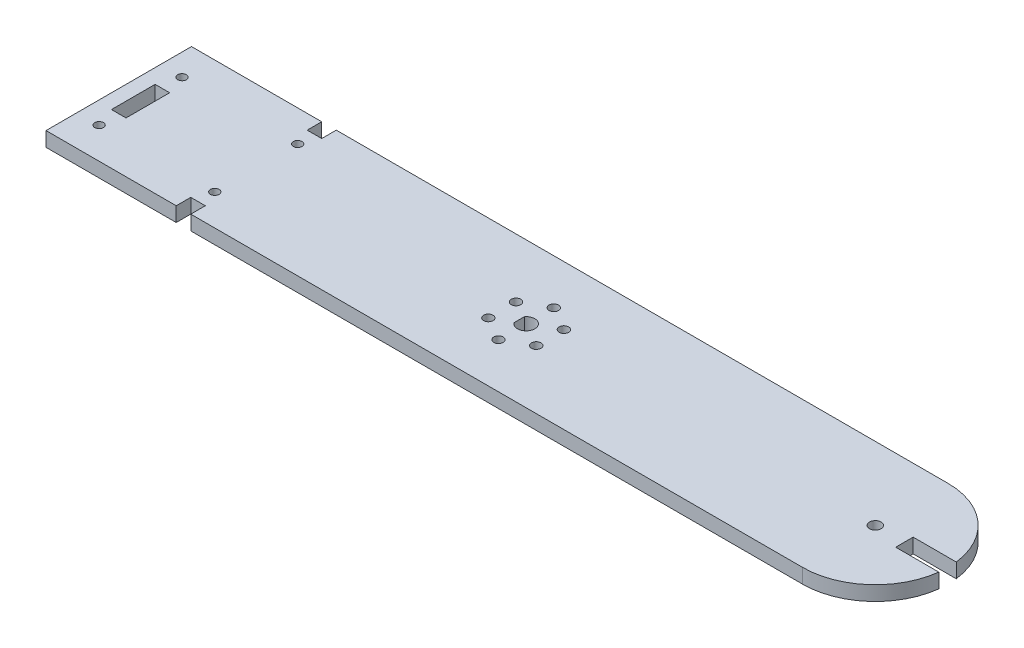
ISO-10303-21;
HEADER;
FILE_DESCRIPTION(('STEP AP214'),'2;1');
FILE_NAME('part.step','',(''),(''),'','','');
FILE_SCHEMA(('AUTOMOTIVE_DESIGN { 1 0 10303 214 1 1 1 1 }'));
ENDSEC;
DATA;
#1=APPLICATION_CONTEXT('core data for automotive mechanical design processes');
#2=APPLICATION_PROTOCOL_DEFINITION('international standard','automotive_design',2000,#1);
#3=PRODUCT_CONTEXT('',#1,'mechanical');
#4=PRODUCT('Part','Part','',(#3));
#5=PRODUCT_RELATED_PRODUCT_CATEGORY('part','',(#4));
#6=PRODUCT_DEFINITION_FORMATION('','',#4);
#7=PRODUCT_DEFINITION_CONTEXT('part definition',#1,'design');
#8=PRODUCT_DEFINITION('design','',#6,#7);
#9=PRODUCT_DEFINITION_SHAPE('','',#8);
#10=(LENGTH_UNIT() NAMED_UNIT(*) SI_UNIT(.MILLI.,.METRE.));
#11=(NAMED_UNIT(*) PLANE_ANGLE_UNIT() SI_UNIT($,.RADIAN.));
#12=(NAMED_UNIT(*) SI_UNIT($,.STERADIAN.) SOLID_ANGLE_UNIT());
#13=UNCERTAINTY_MEASURE_WITH_UNIT(LENGTH_MEASURE(1.E-05),#10,'distance_accuracy_value','');
#14=(GEOMETRIC_REPRESENTATION_CONTEXT(3) GLOBAL_UNCERTAINTY_ASSIGNED_CONTEXT((#13)) GLOBAL_UNIT_ASSIGNED_CONTEXT((#10,
#11,#12)) REPRESENTATION_CONTEXT('',''));
#15=CARTESIAN_POINT('',(0.,0.,0.));
#16=DIRECTION('',(0.,0.,1.));
#17=DIRECTION('',(1.,0.,0.));
#18=AXIS2_PLACEMENT_3D('',#15,#16,#17);
#19=CARTESIAN_POINT('',(260.,5.,-25.));
#20=DIRECTION('',(0.,-1.,0.));
#21=DIRECTION('',(0.,0.,-1.));
#22=AXIS2_PLACEMENT_3D('',#19,#20,#21);
#23=PLANE('',#22);
#24=DIRECTION('',(0.,0.,-1.));
#25=VECTOR('',#24,1.);
#26=CARTESIAN_POINT('',(137.6,5.,-23.1999999999999));
#27=LINE('',#26,#25);
#28=CARTESIAN_POINT('',(137.6,5.,-23.1999999999999));
#29=VERTEX_POINT('',#28);
#30=CARTESIAN_POINT('',(137.6,5.,-26.7999999999999));
#31=VERTEX_POINT('',#30);
#32=EDGE_CURVE('E862',#29,#31,#27,.T.);
#33=ORIENTED_EDGE('',*,*,#32,.T.);
#34=CARTESIAN_POINT('',(140.,5.,-25.));
#35=DIRECTION('',(0.,-1.,0.));
#36=DIRECTION('',(0.,0.,-1.));
#37=AXIS2_PLACEMENT_3D('',#34,#35,#36);
#38=CIRCLE('',#37,3.00000000000001);
#39=EDGE_CURVE('E725',#31,#29,#38,.T.);
#40=ORIENTED_EDGE('',*,*,#39,.T.);
#41=EDGE_LOOP('',(#33,#40));
#42=FACE_BOUND('',#41,.T.);
#43=CARTESIAN_POINT('',(47.25,5.,-10.75));
#44=DIRECTION('',(0.,-1.,0.));
#45=DIRECTION('',(0.,0.,-1.));
#46=AXIS2_PLACEMENT_3D('',#43,#44,#45);
#47=CIRCLE('',#46,1.5);
#48=CARTESIAN_POINT('',(47.25,5.,-12.25));
#49=VERTEX_POINT('',#48);
#50=EDGE_CURVE('E892',#49,#49,#47,.T.);
#51=ORIENTED_EDGE('',*,*,#50,.T.);
#52=EDGE_LOOP('',(#51));
#53=FACE_BOUND('',#52,.T.);
#54=CARTESIAN_POINT('',(7.50000000000001,5.,-39.25));
#55=DIRECTION('',(0.,-1.,0.));
#56=DIRECTION('',(0.,0.,-1.));
#57=AXIS2_PLACEMENT_3D('',#54,#55,#56);
#58=CIRCLE('',#57,1.5);
#59=CARTESIAN_POINT('',(7.50000000000001,5.,-40.75));
#60=VERTEX_POINT('',#59);
#61=EDGE_CURVE('E898',#60,#60,#58,.T.);
#62=ORIENTED_EDGE('',*,*,#61,.T.);
#63=EDGE_LOOP('',(#62));
#64=FACE_BOUND('',#63,.T.);
#65=DIRECTION('',(1.,0.,0.));
#66=VECTOR('',#65,1.);
#67=CARTESIAN_POINT('',(0.,5.,0.));
#68=LINE('',#67,#66);
#69=CARTESIAN_POINT('',(0.,5.,0.));
#70=VERTEX_POINT('',#69);
#71=CARTESIAN_POINT('',(44.75,5.,0.));
#72=VERTEX_POINT('',#71);
#73=EDGE_CURVE('E936',#70,#72,#68,.T.);
#74=ORIENTED_EDGE('',*,*,#73,.T.);
#75=DIRECTION('',(0.,0.,-1.));
#76=VECTOR('',#75,1.);
#77=CARTESIAN_POINT('',(44.75,5.,0.));
#78=LINE('',#77,#76);
#79=CARTESIAN_POINT('',(44.75,5.,-5.));
#80=VERTEX_POINT('',#79);
#81=EDGE_CURVE('E939',#72,#80,#78,.T.);
#82=ORIENTED_EDGE('',*,*,#81,.T.);
#83=DIRECTION('',(1.,0.,0.));
#84=VECTOR('',#83,1.);
#85=CARTESIAN_POINT('',(44.75,5.,-5.));
#86=LINE('',#85,#84);
#87=CARTESIAN_POINT('',(49.75,5.,-5.));
#88=VERTEX_POINT('',#87);
#89=EDGE_CURVE('E942',#80,#88,#86,.T.);
#90=ORIENTED_EDGE('',*,*,#89,.T.);
#91=DIRECTION('',(0.,0.,1.));
#92=VECTOR('',#91,1.);
#93=CARTESIAN_POINT('',(49.75,5.,-5.));
#94=LINE('',#93,#92);
#95=CARTESIAN_POINT('',(49.75,5.,0.));
#96=VERTEX_POINT('',#95);
#97=EDGE_CURVE('E944',#88,#96,#94,.T.);
#98=ORIENTED_EDGE('',*,*,#97,.T.);
#99=DIRECTION('',(1.,0.,0.));
#100=VECTOR('',#99,1.);
#101=CARTESIAN_POINT('',(49.75,5.,0.));
#102=LINE('',#101,#100);
#103=CARTESIAN_POINT('',(260.,5.,0.));
#104=VERTEX_POINT('',#103);
#105=EDGE_CURVE('E946',#96,#104,#102,.T.);
#106=ORIENTED_EDGE('',*,*,#105,.T.);
#107=CARTESIAN_POINT('',(260.,5.,-25.));
#108=DIRECTION('',(0.,-1.,0.));
#109=DIRECTION('',(0.,0.,-1.));
#110=AXIS2_PLACEMENT_3D('',#107,#108,#109);
#111=CIRCLE('',#110,25.);
#112=CARTESIAN_POINT('',(284.819347291982,5.,-22.));
#113=VERTEX_POINT('',#112);
#114=EDGE_CURVE('E948',#113,#104,#111,.T.);
#115=ORIENTED_EDGE('',*,*,#114,.F.);
#116=DIRECTION('',(1.,0.,0.));
#117=VECTOR('',#116,1.);
#118=CARTESIAN_POINT('',(270.,5.,-22.));
#119=LINE('',#118,#117);
#120=CARTESIAN_POINT('',(270.,5.,-22.));
#121=VERTEX_POINT('',#120);
#122=EDGE_CURVE('E951',#121,#113,#119,.T.);
#123=ORIENTED_EDGE('',*,*,#122,.F.);
#124=DIRECTION('',(0.,0.,-1.));
#125=VECTOR('',#124,1.);
#126=CARTESIAN_POINT('',(270.,5.,-22.));
#127=LINE('',#126,#125);
#128=CARTESIAN_POINT('',(270.,5.,-28.));
#129=VERTEX_POINT('',#128);
#130=EDGE_CURVE('E954',#121,#129,#127,.T.);
#131=ORIENTED_EDGE('',*,*,#130,.T.);
#132=DIRECTION('',(1.,0.,0.));
#133=VECTOR('',#132,1.);
#134=CARTESIAN_POINT('',(270.,5.,-28.));
#135=LINE('',#134,#133);
#136=CARTESIAN_POINT('',(284.819347291982,5.,-28.));
#137=VERTEX_POINT('',#136);
#138=EDGE_CURVE('E956',#129,#137,#135,.T.);
#139=ORIENTED_EDGE('',*,*,#138,.T.);
#140=CARTESIAN_POINT('',(260.,5.,-25.));
#141=DIRECTION('',(0.,-1.,0.));
#142=DIRECTION('',(0.,0.,-1.));
#143=AXIS2_PLACEMENT_3D('',#140,#141,#142);
#144=CIRCLE('',#143,25.);
#145=CARTESIAN_POINT('',(260.,5.,-50.));
#146=VERTEX_POINT('',#145);
#147=EDGE_CURVE('E958',#146,#137,#144,.T.);
#148=ORIENTED_EDGE('',*,*,#147,.F.);
#149=DIRECTION('',(1.,0.,0.));
#150=VECTOR('',#149,1.);
#151=CARTESIAN_POINT('',(49.75,5.,-50.));
#152=LINE('',#151,#150);
#153=CARTESIAN_POINT('',(49.75,5.,-50.));
#154=VERTEX_POINT('',#153);
#155=EDGE_CURVE('E961',#154,#146,#152,.T.);
#156=ORIENTED_EDGE('',*,*,#155,.F.);
#157=DIRECTION('',(0.,0.,-1.));
#158=VECTOR('',#157,1.);
#159=CARTESIAN_POINT('',(49.75,5.,-45.));
#160=LINE('',#159,#158);
#161=CARTESIAN_POINT('',(49.75,5.,-45.));
#162=VERTEX_POINT('',#161);
#163=EDGE_CURVE('E964',#162,#154,#160,.T.);
#164=ORIENTED_EDGE('',*,*,#163,.F.);
#165=DIRECTION('',(1.,0.,0.));
#166=VECTOR('',#165,1.);
#167=CARTESIAN_POINT('',(44.75,5.,-45.));
#168=LINE('',#167,#166);
#169=CARTESIAN_POINT('',(44.75,5.,-45.));
#170=VERTEX_POINT('',#169);
#171=EDGE_CURVE('E967',#170,#162,#168,.T.);
#172=ORIENTED_EDGE('',*,*,#171,.F.);
#173=DIRECTION('',(0.,0.,1.));
#174=VECTOR('',#173,1.);
#175=CARTESIAN_POINT('',(44.75,5.,-50.));
#176=LINE('',#175,#174);
#177=CARTESIAN_POINT('',(44.75,5.,-50.));
#178=VERTEX_POINT('',#177);
#179=EDGE_CURVE('E970',#178,#170,#176,.T.);
#180=ORIENTED_EDGE('',*,*,#179,.F.);
#181=DIRECTION('',(1.,0.,0.));
#182=VECTOR('',#181,1.);
#183=CARTESIAN_POINT('',(0.,5.,-50.));
#184=LINE('',#183,#182);
#185=CARTESIAN_POINT('',(0.,5.,-50.));
#186=VERTEX_POINT('',#185);
#187=EDGE_CURVE('E973',#186,#178,#184,.T.);
#188=ORIENTED_EDGE('',*,*,#187,.F.);
#189=DIRECTION('',(0.,0.,-1.));
#190=VECTOR('',#189,1.);
#191=CARTESIAN_POINT('',(0.,5.,0.));
#192=LINE('',#191,#190);
#193=EDGE_CURVE('E976',#70,#186,#192,.T.);
#194=ORIENTED_EDGE('',*,*,#193,.F.);
#195=EDGE_LOOP('',(#74,#82,#90,#98,#106,#115,#123,#131,#139,#148,#156,#164,#172,#180,#188,#194));
#196=FACE_BOUND('',#195,.T.);
#197=DIRECTION('',(0.,0.,1.));
#198=VECTOR('',#197,1.);
#199=CARTESIAN_POINT('',(5.,5.,-32.5));
#200=LINE('',#199,#198);
#201=CARTESIAN_POINT('',(5.,5.,-32.5));
#202=VERTEX_POINT('',#201);
#203=CARTESIAN_POINT('',(5.,5.,-17.5));
#204=VERTEX_POINT('',#203);
#205=EDGE_CURVE('E904',#202,#204,#200,.T.);
#206=ORIENTED_EDGE('',*,*,#205,.F.);
#207=DIRECTION('',(1.,0.,0.));
#208=VECTOR('',#207,1.);
#209=CARTESIAN_POINT('',(5.,5.,-32.5));
#210=LINE('',#209,#208);
#211=CARTESIAN_POINT('',(10.,5.,-32.5));
#212=VERTEX_POINT('',#211);
#213=EDGE_CURVE('E912',#202,#212,#210,.T.);
#214=ORIENTED_EDGE('',*,*,#213,.T.);
#215=DIRECTION('',(0.,0.,1.));
#216=VECTOR('',#215,1.);
#217=CARTESIAN_POINT('',(10.,5.,-32.5));
#218=LINE('',#217,#216);
#219=CARTESIAN_POINT('',(10.,5.,-17.5));
#220=VERTEX_POINT('',#219);
#221=EDGE_CURVE('E909',#212,#220,#218,.T.);
#222=ORIENTED_EDGE('',*,*,#221,.T.);
#223=DIRECTION('',(1.,0.,0.));
#224=VECTOR('',#223,1.);
#225=CARTESIAN_POINT('',(5.,5.,-17.5));
#226=LINE('',#225,#224);
#227=EDGE_CURVE('E906',#204,#220,#226,.T.);
#228=ORIENTED_EDGE('',*,*,#227,.F.);
#229=EDGE_LOOP('',(#206,#214,#222,#228));
#230=FACE_BOUND('',#229,.T.);
#231=CARTESIAN_POINT('',(47.25,5.,-39.25));
#232=DIRECTION('',(0.,1.,0.));
#233=DIRECTION('',(0.,0.,1.));
#234=AXIS2_PLACEMENT_3D('',#231,#232,#233);
#235=CIRCLE('',#234,1.5);
#236=CARTESIAN_POINT('',(47.25,5.,-37.75));
#237=VERTEX_POINT('',#236);
#238=EDGE_CURVE('E886',#237,#237,#235,.T.);
#239=ORIENTED_EDGE('',*,*,#238,.F.);
#240=EDGE_LOOP('',(#239));
#241=FACE_BOUND('',#240,.T.);
#242=CARTESIAN_POINT('',(7.50000000000001,5.,-10.75));
#243=DIRECTION('',(0.,1.,0.));
#244=DIRECTION('',(0.,0.,1.));
#245=AXIS2_PLACEMENT_3D('',#242,#243,#244);
#246=CIRCLE('',#245,1.5);
#247=CARTESIAN_POINT('',(7.50000000000001,5.,-9.25000000000001));
#248=VERTEX_POINT('',#247);
#249=EDGE_CURVE('E880',#248,#248,#246,.T.);
#250=ORIENTED_EDGE('',*,*,#249,.F.);
#251=EDGE_LOOP('',(#250));
#252=FACE_BOUND('',#251,.T.);
#253=CARTESIAN_POINT('',(131.772758664048,5.,-20.2499999999999));
#254=DIRECTION('',(0.,1.,0.));
#255=DIRECTION('',(0.,0.,1.));
#256=AXIS2_PLACEMENT_3D('',#253,#254,#255);
#257=CIRCLE('',#256,1.63);
#258=CARTESIAN_POINT('',(131.772758664048,5.,-18.6199999999999));
#259=VERTEX_POINT('',#258);
#260=EDGE_CURVE('E876',#259,#259,#257,.T.);
#261=ORIENTED_EDGE('',*,*,#260,.F.);
#262=EDGE_LOOP('',(#261));
#263=FACE_BOUND('',#262,.T.);
#264=CARTESIAN_POINT('',(131.772758664048,5.,-29.7499999999998));
#265=DIRECTION('',(0.,1.,0.));
#266=DIRECTION('',(0.,0.,1.));
#267=AXIS2_PLACEMENT_3D('',#264,#265,#266);
#268=CIRCLE('',#267,1.63);
#269=CARTESIAN_POINT('',(131.772758664048,5.,-28.1199999999998));
#270=VERTEX_POINT('',#269);
#271=EDGE_CURVE('E1470',#270,#270,#268,.T.);
#272=ORIENTED_EDGE('',*,*,#271,.F.);
#273=EDGE_LOOP('',(#272));
#274=FACE_BOUND('',#273,.T.);
#275=CARTESIAN_POINT('',(140.,5.,-34.5));
#276=DIRECTION('',(0.,1.,0.));
#277=DIRECTION('',(0.,0.,1.));
#278=AXIS2_PLACEMENT_3D('',#275,#276,#277);
#279=CIRCLE('',#278,1.62999999999999);
#280=CARTESIAN_POINT('',(140.,5.,-32.87));
#281=VERTEX_POINT('',#280);
#282=EDGE_CURVE('E1464',#281,#281,#279,.T.);
#283=ORIENTED_EDGE('',*,*,#282,.F.);
#284=EDGE_LOOP('',(#283));
#285=FACE_BOUND('',#284,.T.);
#286=CARTESIAN_POINT('',(148.227241335952,5.,-29.7500000000002));
#287=DIRECTION('',(0.,1.,0.));
#288=DIRECTION('',(0.,0.,1.));
#289=AXIS2_PLACEMENT_3D('',#286,#287,#288);
#290=CIRCLE('',#289,1.63);
#291=CARTESIAN_POINT('',(148.227241335952,5.,-28.1200000000002));
#292=VERTEX_POINT('',#291);
#293=EDGE_CURVE('E1458',#292,#292,#290,.T.);
#294=ORIENTED_EDGE('',*,*,#293,.F.);
#295=EDGE_LOOP('',(#294));
#296=FACE_BOUND('',#295,.T.);
#297=CARTESIAN_POINT('',(148.227241335952,5.,-20.2500000000002));
#298=DIRECTION('',(0.,1.,0.));
#299=DIRECTION('',(0.,0.,1.));
#300=AXIS2_PLACEMENT_3D('',#297,#298,#299);
#301=CIRCLE('',#300,1.63);
#302=CARTESIAN_POINT('',(148.227241335952,5.,-18.6200000000002));
#303=VERTEX_POINT('',#302);
#304=EDGE_CURVE('E1452',#303,#303,#301,.T.);
#305=ORIENTED_EDGE('',*,*,#304,.F.);
#306=EDGE_LOOP('',(#305));
#307=FACE_BOUND('',#306,.T.);
#308=CARTESIAN_POINT('',(140.,5.,-15.5));
#309=DIRECTION('',(0.,1.,0.));
#310=DIRECTION('',(0.,0.,1.));
#311=AXIS2_PLACEMENT_3D('',#308,#309,#310);
#312=CIRCLE('',#311,1.63);
#313=CARTESIAN_POINT('',(140.,5.,-13.87));
#314=VERTEX_POINT('',#313);
#315=EDGE_CURVE('E1446',#314,#314,#312,.T.);
#316=ORIENTED_EDGE('',*,*,#315,.F.);
#317=EDGE_LOOP('',(#316));
#318=FACE_BOUND('',#317,.T.);
#319=CARTESIAN_POINT('',(260.,5.,-25.));
#320=DIRECTION('',(0.,1.,0.));
#321=DIRECTION('',(0.,0.,1.));
#322=AXIS2_PLACEMENT_3D('',#319,#320,#321);
#323=CIRCLE('',#322,2.);
#324=CARTESIAN_POINT('',(260.,5.,-23.));
#325=VERTEX_POINT('',#324);
#326=EDGE_CURVE('E1437',#325,#325,#323,.T.);
#327=ORIENTED_EDGE('',*,*,#326,.F.);
#328=EDGE_LOOP('',(#327));
#329=FACE_BOUND('',#328,.T.);
#330=ADVANCED_FACE('F710',(#42,#53,#64,#196,#230,#241,#252,#263,#274,#285,#296,#307,#318,#329),
#23,.F.);
#331=CARTESIAN_POINT('',(260.,0.,-25.));
#332=DIRECTION('',(0.,-1.,0.));
#333=DIRECTION('',(0.,0.,-1.));
#334=AXIS2_PLACEMENT_3D('',#331,#332,#333);
#335=PLANE('',#334);
#336=CARTESIAN_POINT('',(140.,0.,-15.5));
#337=DIRECTION('',(0.,1.,0.));
#338=DIRECTION('',(0.,0.,1.));
#339=AXIS2_PLACEMENT_3D('',#336,#337,#338);
#340=CIRCLE('',#339,1.63);
#341=CARTESIAN_POINT('',(140.,0.,-13.87));
#342=VERTEX_POINT('',#341);
#343=EDGE_CURVE('E1443',#342,#342,#340,.T.);
#344=ORIENTED_EDGE('',*,*,#343,.T.);
#345=EDGE_LOOP('',(#344));
#346=FACE_BOUND('',#345,.T.);
#347=CARTESIAN_POINT('',(148.227241335952,0.,-29.7500000000002));
#348=DIRECTION('',(0.,1.,0.));
#349=DIRECTION('',(0.,0.,1.));
#350=AXIS2_PLACEMENT_3D('',#347,#348,#349);
#351=CIRCLE('',#350,1.63);
#352=CARTESIAN_POINT('',(148.227241335952,0.,-28.1200000000002));
#353=VERTEX_POINT('',#352);
#354=EDGE_CURVE('E1455',#353,#353,#351,.T.);
#355=ORIENTED_EDGE('',*,*,#354,.T.);
#356=EDGE_LOOP('',(#355));
#357=FACE_BOUND('',#356,.T.);
#358=CARTESIAN_POINT('',(131.772758664048,0.,-29.7499999999998));
#359=DIRECTION('',(0.,1.,0.));
#360=DIRECTION('',(0.,0.,1.));
#361=AXIS2_PLACEMENT_3D('',#358,#359,#360);
#362=CIRCLE('',#361,1.63);
#363=CARTESIAN_POINT('',(131.772758664048,0.,-28.1199999999998));
#364=VERTEX_POINT('',#363);
#365=EDGE_CURVE('E1467',#364,#364,#362,.T.);
#366=ORIENTED_EDGE('',*,*,#365,.T.);
#367=EDGE_LOOP('',(#366));
#368=FACE_BOUND('',#367,.T.);
#369=CARTESIAN_POINT('',(7.50000000000001,0.,-10.75));
#370=DIRECTION('',(0.,1.,0.));
#371=DIRECTION('',(0.,0.,1.));
#372=AXIS2_PLACEMENT_3D('',#369,#370,#371);
#373=CIRCLE('',#372,1.5);
#374=CARTESIAN_POINT('',(7.50000000000001,0.,-9.25000000000001));
#375=VERTEX_POINT('',#374);
#376=EDGE_CURVE('E878',#375,#375,#373,.T.);
#377=ORIENTED_EDGE('',*,*,#376,.T.);
#378=EDGE_LOOP('',(#377));
#379=FACE_BOUND('',#378,.T.);
#380=DIRECTION('',(1.,0.,0.));
#381=VECTOR('',#380,1.);
#382=CARTESIAN_POINT('',(5.,0.,-32.5));
#383=LINE('',#382,#381);
#384=CARTESIAN_POINT('',(4.99999999999995,0.,-32.5));
#385=VERTEX_POINT('',#384);
#386=CARTESIAN_POINT('',(10.,0.,-32.5));
#387=VERTEX_POINT('',#386);
#388=EDGE_CURVE('E907',#385,#387,#383,.T.);
#389=ORIENTED_EDGE('',*,*,#388,.F.);
#390=DIRECTION('',(0.,0.,1.));
#391=VECTOR('',#390,1.);
#392=CARTESIAN_POINT('',(5.,0.,-32.5));
#393=LINE('',#392,#391);
#394=CARTESIAN_POINT('',(5.,0.,-17.5));
#395=VERTEX_POINT('',#394);
#396=EDGE_CURVE('E901',#385,#395,#393,.T.);
#397=ORIENTED_EDGE('',*,*,#396,.T.);
#398=DIRECTION('',(1.,0.,0.));
#399=VECTOR('',#398,1.);
#400=CARTESIAN_POINT('',(5.,0.,-17.5));
#401=LINE('',#400,#399);
#402=CARTESIAN_POINT('',(10.,0.,-17.5));
#403=VERTEX_POINT('',#402);
#404=EDGE_CURVE('E918',#395,#403,#401,.T.);
#405=ORIENTED_EDGE('',*,*,#404,.T.);
#406=DIRECTION('',(0.,0.,1.));
#407=VECTOR('',#406,1.);
#408=CARTESIAN_POINT('',(10.,0.,-32.5));
#409=LINE('',#408,#407);
#410=EDGE_CURVE('E921',#387,#403,#409,.T.);
#411=ORIENTED_EDGE('',*,*,#410,.F.);
#412=EDGE_LOOP('',(#389,#397,#405,#411));
#413=FACE_BOUND('',#412,.T.);
#414=DIRECTION('',(1.,0.,0.));
#415=VECTOR('',#414,1.);
#416=CARTESIAN_POINT('',(0.,0.,0.));
#417=LINE('',#416,#415);
#418=CARTESIAN_POINT('',(0.,0.,0.));
#419=VERTEX_POINT('',#418);
#420=CARTESIAN_POINT('',(44.75,0.,0.));
#421=VERTEX_POINT('',#420);
#422=EDGE_CURVE('E935',#419,#421,#417,.T.);
#423=ORIENTED_EDGE('',*,*,#422,.F.);
#424=DIRECTION('',(0.,0.,-1.));
#425=VECTOR('',#424,1.);
#426=CARTESIAN_POINT('',(0.,0.,0.));
#427=LINE('',#426,#425);
#428=CARTESIAN_POINT('',(0.,0.,-50.));
#429=VERTEX_POINT('',#428);
#430=EDGE_CURVE('E940',#419,#429,#427,.T.);
#431=ORIENTED_EDGE('',*,*,#430,.T.);
#432=DIRECTION('',(1.,0.,0.));
#433=VECTOR('',#432,1.);
#434=CARTESIAN_POINT('',(0.,0.,-50.));
#435=LINE('',#434,#433);
#436=CARTESIAN_POINT('',(44.75,0.,-50.));
#437=VERTEX_POINT('',#436);
#438=EDGE_CURVE('E1017',#429,#437,#435,.T.);
#439=ORIENTED_EDGE('',*,*,#438,.T.);
#440=DIRECTION('',(0.,0.,1.));
#441=VECTOR('',#440,1.);
#442=CARTESIAN_POINT('',(44.75,0.,-50.));
#443=LINE('',#442,#441);
#444=CARTESIAN_POINT('',(44.75,0.,-45.));
#445=VERTEX_POINT('',#444);
#446=EDGE_CURVE('E1014',#437,#445,#443,.T.);
#447=ORIENTED_EDGE('',*,*,#446,.T.);
#448=DIRECTION('',(1.,0.,0.));
#449=VECTOR('',#448,1.);
#450=CARTESIAN_POINT('',(44.75,0.,-45.));
#451=LINE('',#450,#449);
#452=CARTESIAN_POINT('',(49.75,0.,-45.));
#453=VERTEX_POINT('',#452);
#454=EDGE_CURVE('E1011',#445,#453,#451,.T.);
#455=ORIENTED_EDGE('',*,*,#454,.T.);
#456=DIRECTION('',(0.,0.,-1.));
#457=VECTOR('',#456,1.);
#458=CARTESIAN_POINT('',(49.75,0.,-45.));
#459=LINE('',#458,#457);
#460=CARTESIAN_POINT('',(49.75,0.,-50.));
#461=VERTEX_POINT('',#460);
#462=EDGE_CURVE('E1008',#453,#461,#459,.T.);
#463=ORIENTED_EDGE('',*,*,#462,.T.);
#464=DIRECTION('',(1.,0.,0.));
#465=VECTOR('',#464,1.);
#466=CARTESIAN_POINT('',(49.75,0.,-50.));
#467=LINE('',#466,#465);
#468=CARTESIAN_POINT('',(260.,0.,-50.));
#469=VERTEX_POINT('',#468);
#470=EDGE_CURVE('E1005',#461,#469,#467,.T.);
#471=ORIENTED_EDGE('',*,*,#470,.T.);
#472=CARTESIAN_POINT('',(260.,0.,-25.));
#473=DIRECTION('',(0.,-1.,0.));
#474=DIRECTION('',(0.,0.,-1.));
#475=AXIS2_PLACEMENT_3D('',#472,#473,#474);
#476=CIRCLE('',#475,25.);
#477=CARTESIAN_POINT('',(284.819347291982,0.,-28.));
#478=VERTEX_POINT('',#477);
#479=EDGE_CURVE('E1002',#469,#478,#476,.T.);
#480=ORIENTED_EDGE('',*,*,#479,.T.);
#481=DIRECTION('',(1.,0.,0.));
#482=VECTOR('',#481,1.);
#483=CARTESIAN_POINT('',(270.,0.,-28.));
#484=LINE('',#483,#482);
#485=CARTESIAN_POINT('',(270.,0.,-28.));
#486=VERTEX_POINT('',#485);
#487=EDGE_CURVE('E999',#486,#478,#484,.T.);
#488=ORIENTED_EDGE('',*,*,#487,.F.);
#489=DIRECTION('',(0.,0.,-1.));
#490=VECTOR('',#489,1.);
#491=CARTESIAN_POINT('',(270.,0.,-22.));
#492=LINE('',#491,#490);
#493=CARTESIAN_POINT('',(270.,0.,-22.));
#494=VERTEX_POINT('',#493);
#495=EDGE_CURVE('E997',#494,#486,#492,.T.);
#496=ORIENTED_EDGE('',*,*,#495,.F.);
#497=DIRECTION('',(1.,0.,0.));
#498=VECTOR('',#497,1.);
#499=CARTESIAN_POINT('',(270.,0.,-22.));
#500=LINE('',#499,#498);
#501=CARTESIAN_POINT('',(284.819347291982,0.,-22.));
#502=VERTEX_POINT('',#501);
#503=EDGE_CURVE('E994',#494,#502,#500,.T.);
#504=ORIENTED_EDGE('',*,*,#503,.T.);
#505=CARTESIAN_POINT('',(260.,0.,-25.));
#506=DIRECTION('',(0.,-1.,0.));
#507=DIRECTION('',(0.,0.,-1.));
#508=AXIS2_PLACEMENT_3D('',#505,#506,#507);
#509=CIRCLE('',#508,25.);
#510=CARTESIAN_POINT('',(260.,0.,0.));
#511=VERTEX_POINT('',#510);
#512=EDGE_CURVE('E991',#502,#511,#509,.T.);
#513=ORIENTED_EDGE('',*,*,#512,.T.);
#514=DIRECTION('',(1.,0.,0.));
#515=VECTOR('',#514,1.);
#516=CARTESIAN_POINT('',(49.75,0.,0.));
#517=LINE('',#516,#515);
#518=CARTESIAN_POINT('',(49.75,0.,0.));
#519=VERTEX_POINT('',#518);
#520=EDGE_CURVE('E988',#519,#511,#517,.T.);
#521=ORIENTED_EDGE('',*,*,#520,.F.);
#522=DIRECTION('',(0.,0.,1.));
#523=VECTOR('',#522,1.);
#524=CARTESIAN_POINT('',(49.75,0.,-5.));
#525=LINE('',#524,#523);
#526=CARTESIAN_POINT('',(49.75,0.,-5.));
#527=VERTEX_POINT('',#526);
#528=EDGE_CURVE('E986',#527,#519,#525,.T.);
#529=ORIENTED_EDGE('',*,*,#528,.F.);
#530=DIRECTION('',(1.,0.,0.));
#531=VECTOR('',#530,1.);
#532=CARTESIAN_POINT('',(44.75,0.,-5.));
#533=LINE('',#532,#531);
#534=CARTESIAN_POINT('',(44.75,0.,-5.));
#535=VERTEX_POINT('',#534);
#536=EDGE_CURVE('E984',#535,#527,#533,.T.);
#537=ORIENTED_EDGE('',*,*,#536,.F.);
#538=DIRECTION('',(0.,0.,-1.));
#539=VECTOR('',#538,1.);
#540=CARTESIAN_POINT('',(44.75,0.,0.));
#541=LINE('',#540,#539);
#542=EDGE_CURVE('E982',#421,#535,#541,.T.);
#543=ORIENTED_EDGE('',*,*,#542,.F.);
#544=EDGE_LOOP('',(#423,#431,#439,#447,#455,#463,#471,#480,#488,#496,#504,#513,#521,#529,#537,#543));
#545=FACE_BOUND('',#544,.T.);
#546=CARTESIAN_POINT('',(7.50000000000001,0.,-39.25));
#547=DIRECTION('',(0.,-1.,0.));
#548=DIRECTION('',(0.,0.,-1.));
#549=AXIS2_PLACEMENT_3D('',#546,#547,#548);
#550=CIRCLE('',#549,1.5);
#551=CARTESIAN_POINT('',(7.50000000000001,0.,-40.75));
#552=VERTEX_POINT('',#551);
#553=EDGE_CURVE('E895',#552,#552,#550,.T.);
#554=ORIENTED_EDGE('',*,*,#553,.F.);
#555=EDGE_LOOP('',(#554));
#556=FACE_BOUND('',#555,.T.);
#557=CARTESIAN_POINT('',(47.25,0.,-10.75));
#558=DIRECTION('',(0.,-1.,0.));
#559=DIRECTION('',(0.,0.,-1.));
#560=AXIS2_PLACEMENT_3D('',#557,#558,#559);
#561=CIRCLE('',#560,1.5);
#562=CARTESIAN_POINT('',(47.25,0.,-12.25));
#563=VERTEX_POINT('',#562);
#564=EDGE_CURVE('E889',#563,#563,#561,.T.);
#565=ORIENTED_EDGE('',*,*,#564,.F.);
#566=EDGE_LOOP('',(#565));
#567=FACE_BOUND('',#566,.T.);
#568=CARTESIAN_POINT('',(47.25,0.,-39.25));
#569=DIRECTION('',(0.,1.,0.));
#570=DIRECTION('',(0.,0.,1.));
#571=AXIS2_PLACEMENT_3D('',#568,#569,#570);
#572=CIRCLE('',#571,1.5);
#573=CARTESIAN_POINT('',(47.25,0.,-37.75));
#574=VERTEX_POINT('',#573);
#575=EDGE_CURVE('E883',#574,#574,#572,.T.);
#576=ORIENTED_EDGE('',*,*,#575,.T.);
#577=EDGE_LOOP('',(#576));
#578=FACE_BOUND('',#577,.T.);
#579=CARTESIAN_POINT('',(140.,0.,-25.));
#580=DIRECTION('',(0.,-1.,0.));
#581=DIRECTION('',(0.,0.,-1.));
#582=AXIS2_PLACEMENT_3D('',#579,#580,#581);
#583=CIRCLE('',#582,3.00000000000001);
#584=CARTESIAN_POINT('',(137.6,0.,-26.7999999999999));
#585=VERTEX_POINT('',#584);
#586=CARTESIAN_POINT('',(137.6,0.,-23.1999999999999));
#587=VERTEX_POINT('',#586);
#588=EDGE_CURVE('E730',#585,#587,#583,.T.);
#589=ORIENTED_EDGE('',*,*,#588,.F.);
#590=DIRECTION('',(0.,0.,-1.));
#591=VECTOR('',#590,1.);
#592=CARTESIAN_POINT('',(137.6,0.,-23.1999999999999));
#593=LINE('',#592,#591);
#594=EDGE_CURVE('E869',#587,#585,#593,.T.);
#595=ORIENTED_EDGE('',*,*,#594,.F.);
#596=EDGE_LOOP('',(#589,#595));
#597=FACE_BOUND('',#596,.T.);
#598=CARTESIAN_POINT('',(131.772758664048,0.,-20.2499999999999));
#599=DIRECTION('',(0.,1.,0.));
#600=DIRECTION('',(0.,0.,1.));
#601=AXIS2_PLACEMENT_3D('',#598,#599,#600);
#602=CIRCLE('',#601,1.63);
#603=CARTESIAN_POINT('',(131.772758664048,0.,-18.6199999999999));
#604=VERTEX_POINT('',#603);
#605=EDGE_CURVE('E873',#604,#604,#602,.T.);
#606=ORIENTED_EDGE('',*,*,#605,.T.);
#607=EDGE_LOOP('',(#606));
#608=FACE_BOUND('',#607,.T.);
#609=CARTESIAN_POINT('',(140.,0.,-34.5));
#610=DIRECTION('',(0.,1.,0.));
#611=DIRECTION('',(0.,0.,1.));
#612=AXIS2_PLACEMENT_3D('',#609,#610,#611);
#613=CIRCLE('',#612,1.62999999999999);
#614=CARTESIAN_POINT('',(140.,0.,-32.87));
#615=VERTEX_POINT('',#614);
#616=EDGE_CURVE('E1461',#615,#615,#613,.T.);
#617=ORIENTED_EDGE('',*,*,#616,.T.);
#618=EDGE_LOOP('',(#617));
#619=FACE_BOUND('',#618,.T.);
#620=CARTESIAN_POINT('',(148.227241335952,0.,-20.2500000000002));
#621=DIRECTION('',(0.,1.,0.));
#622=DIRECTION('',(0.,0.,1.));
#623=AXIS2_PLACEMENT_3D('',#620,#621,#622);
#624=CIRCLE('',#623,1.63);
#625=CARTESIAN_POINT('',(148.227241335952,0.,-18.6200000000002));
#626=VERTEX_POINT('',#625);
#627=EDGE_CURVE('E1449',#626,#626,#624,.T.);
#628=ORIENTED_EDGE('',*,*,#627,.T.);
#629=EDGE_LOOP('',(#628));
#630=FACE_BOUND('',#629,.T.);
#631=CARTESIAN_POINT('',(260.,0.,-25.));
#632=DIRECTION('',(0.,1.,0.));
#633=DIRECTION('',(0.,0.,1.));
#634=AXIS2_PLACEMENT_3D('',#631,#632,#633);
#635=CIRCLE('',#634,2.);
#636=CARTESIAN_POINT('',(260.,0.,-23.));
#637=VERTEX_POINT('',#636);
#638=EDGE_CURVE('E1440',#637,#637,#635,.T.);
#639=ORIENTED_EDGE('',*,*,#638,.T.);
#640=EDGE_LOOP('',(#639));
#641=FACE_BOUND('',#640,.T.);
#642=ADVANCED_FACE('F1062',(#346,#357,#368,#379,#413,#545,#556,#567,#578,#597,#608,#619,#630,
#641),#335,.T.);
#643=CARTESIAN_POINT('',(0.,5.,0.));
#644=DIRECTION('',(0.,0.,-1.));
#645=DIRECTION('',(-1.,0.,0.));
#646=AXIS2_PLACEMENT_3D('',#643,#644,#645);
#647=PLANE('',#646);
#648=ORIENTED_EDGE('',*,*,#422,.T.);
#649=DIRECTION('',(0.,-1.,0.));
#650=VECTOR('',#649,1.);
#651=CARTESIAN_POINT('',(44.75,5.,0.));
#652=LINE('',#651,#650);
#653=EDGE_CURVE('E12',#72,#421,#652,.T.);
#654=ORIENTED_EDGE('',*,*,#653,.F.);
#655=ORIENTED_EDGE('',*,*,#73,.F.);
#656=DIRECTION('',(0.,-1.,0.));
#657=VECTOR('',#656,1.);
#658=CARTESIAN_POINT('',(0.,5.,0.));
#659=LINE('',#658,#657);
#660=EDGE_CURVE('E979',#70,#419,#659,.T.);
#661=ORIENTED_EDGE('',*,*,#660,.T.);
#662=EDGE_LOOP('',(#648,#654,#655,#661));
#663=FACE_BOUND('',#662,.T.);
#664=ADVANCED_FACE('F712',(#663),#647,.F.);
#665=CARTESIAN_POINT('',(44.75,5.,0.));
#666=DIRECTION('',(-1.,0.,0.));
#667=DIRECTION('',(0.,0.,1.));
#668=AXIS2_PLACEMENT_3D('',#665,#666,#667);
#669=PLANE('',#668);
#670=ORIENTED_EDGE('',*,*,#542,.T.);
#671=DIRECTION('',(0.,-1.,0.));
#672=VECTOR('',#671,1.);
#673=CARTESIAN_POINT('',(44.75,5.,-5.));
#674=LINE('',#673,#672);
#675=EDGE_CURVE('E718',#80,#535,#674,.T.);
#676=ORIENTED_EDGE('',*,*,#675,.F.);
#677=ORIENTED_EDGE('',*,*,#81,.F.);
#678=ORIENTED_EDGE('',*,*,#653,.T.);
#679=EDGE_LOOP('',(#670,#676,#677,#678));
#680=FACE_BOUND('',#679,.T.);
#681=ADVANCED_FACE('F1080',(#680),#669,.F.);
#682=CARTESIAN_POINT('',(44.75,5.,-5.));
#683=DIRECTION('',(0.,0.,-1.));
#684=DIRECTION('',(-1.,0.,0.));
#685=AXIS2_PLACEMENT_3D('',#682,#683,#684);
#686=PLANE('',#685);
#687=ORIENTED_EDGE('',*,*,#536,.T.);
#688=DIRECTION('',(0.,-1.,0.));
#689=VECTOR('',#688,1.);
#690=CARTESIAN_POINT('',(49.75,5.,-5.));
#691=LINE('',#690,#689);
#692=EDGE_CURVE('E1049',#88,#527,#691,.T.);
#693=ORIENTED_EDGE('',*,*,#692,.F.);
#694=ORIENTED_EDGE('',*,*,#89,.F.);
#695=ORIENTED_EDGE('',*,*,#675,.T.);
#696=EDGE_LOOP('',(#687,#693,#694,#695));
#697=FACE_BOUND('',#696,.T.);
#698=ADVANCED_FACE('F1056',(#697),#686,.F.);
#699=CARTESIAN_POINT('',(49.75,5.,-5.));
#700=DIRECTION('',(1.,0.,0.));
#701=DIRECTION('',(0.,0.,-1.));
#702=AXIS2_PLACEMENT_3D('',#699,#700,#701);
#703=PLANE('',#702);
#704=ORIENTED_EDGE('',*,*,#528,.T.);
#705=DIRECTION('',(0.,-1.,0.));
#706=VECTOR('',#705,1.);
#707=CARTESIAN_POINT('',(49.75,5.,0.));
#708=LINE('',#707,#706);
#709=EDGE_CURVE('E1046',#96,#519,#708,.T.);
#710=ORIENTED_EDGE('',*,*,#709,.F.);
#711=ORIENTED_EDGE('',*,*,#97,.F.);
#712=ORIENTED_EDGE('',*,*,#692,.T.);
#713=EDGE_LOOP('',(#704,#710,#711,#712));
#714=FACE_BOUND('',#713,.T.);
#715=ADVANCED_FACE('F1067',(#714),#703,.F.);
#716=CARTESIAN_POINT('',(49.75,5.,0.));
#717=DIRECTION('',(0.,0.,-1.));
#718=DIRECTION('',(-1.,0.,0.));
#719=AXIS2_PLACEMENT_3D('',#716,#717,#718);
#720=PLANE('',#719);
#721=ORIENTED_EDGE('',*,*,#520,.T.);
#722=DIRECTION('',(0.,-1.,0.));
#723=VECTOR('',#722,1.);
#724=CARTESIAN_POINT('',(260.,5.,0.));
#725=LINE('',#724,#723);
#726=EDGE_CURVE('E1044',#104,#511,#725,.T.);
#727=ORIENTED_EDGE('',*,*,#726,.F.);
#728=ORIENTED_EDGE('',*,*,#105,.F.);
#729=ORIENTED_EDGE('',*,*,#709,.T.);
#730=EDGE_LOOP('',(#721,#727,#728,#729));
#731=FACE_BOUND('',#730,.T.);
#732=ADVANCED_FACE('F1071',(#731),#720,.F.);
#733=CARTESIAN_POINT('',(260.,5.,-25.));
#734=DIRECTION('',(0.,-1.,0.));
#735=DIRECTION('',(0.,0.,-1.));
#736=AXIS2_PLACEMENT_3D('',#733,#734,#735);
#737=CYLINDRICAL_SURFACE('',#736,25.);
#738=ORIENTED_EDGE('',*,*,#512,.F.);
#739=DIRECTION('',(0.,-1.,0.));
#740=VECTOR('',#739,1.);
#741=CARTESIAN_POINT('',(284.819347291982,5.,-22.));
#742=LINE('',#741,#740);
#743=EDGE_CURVE('E1042',#113,#502,#742,.T.);
#744=ORIENTED_EDGE('',*,*,#743,.F.);
#745=ORIENTED_EDGE('',*,*,#114,.T.);
#746=ORIENTED_EDGE('',*,*,#726,.T.);
#747=EDGE_LOOP('',(#738,#744,#745,#746));
#748=FACE_BOUND('',#747,.T.);
#749=ADVANCED_FACE('F1123',(#748),#737,.T.);
#750=CARTESIAN_POINT('',(270.,5.,-22.));
#751=DIRECTION('',(0.,0.,-1.));
#752=DIRECTION('',(-1.,0.,0.));
#753=AXIS2_PLACEMENT_3D('',#750,#751,#752);
#754=PLANE('',#753);
#755=ORIENTED_EDGE('',*,*,#503,.F.);
#756=DIRECTION('',(0.,-1.,0.));
#757=VECTOR('',#756,1.);
#758=CARTESIAN_POINT('',(270.,5.,-22.));
#759=LINE('',#758,#757);
#760=EDGE_CURVE('E1040',#121,#494,#759,.T.);
#761=ORIENTED_EDGE('',*,*,#760,.F.);
#762=ORIENTED_EDGE('',*,*,#122,.T.);
#763=ORIENTED_EDGE('',*,*,#743,.T.);
#764=EDGE_LOOP('',(#755,#761,#762,#763));
#765=FACE_BOUND('',#764,.T.);
#766=ADVANCED_FACE('F1119',(#765),#754,.T.);
#767=CARTESIAN_POINT('',(270.,5.,-22.));
#768=DIRECTION('',(-1.,0.,0.));
#769=DIRECTION('',(0.,0.,1.));
#770=AXIS2_PLACEMENT_3D('',#767,#768,#769);
#771=PLANE('',#770);
#772=ORIENTED_EDGE('',*,*,#495,.T.);
#773=DIRECTION('',(0.,-1.,0.));
#774=VECTOR('',#773,1.);
#775=CARTESIAN_POINT('',(270.,5.,-28.));
#776=LINE('',#775,#774);
#777=EDGE_CURVE('E1037',#129,#486,#776,.T.);
#778=ORIENTED_EDGE('',*,*,#777,.F.);
#779=ORIENTED_EDGE('',*,*,#130,.F.);
#780=ORIENTED_EDGE('',*,*,#760,.T.);
#781=EDGE_LOOP('',(#772,#778,#779,#780));
#782=FACE_BOUND('',#781,.T.);
#783=ADVANCED_FACE('F1130',(#782),#771,.F.);
#784=CARTESIAN_POINT('',(270.,5.,-28.));
#785=DIRECTION('',(0.,0.,-1.));
#786=DIRECTION('',(-1.,0.,0.));
#787=AXIS2_PLACEMENT_3D('',#784,#785,#786);
#788=PLANE('',#787);
#789=ORIENTED_EDGE('',*,*,#487,.T.);
#790=DIRECTION('',(0.,-1.,0.));
#791=VECTOR('',#790,1.);
#792=CARTESIAN_POINT('',(284.819347291982,5.,-28.));
#793=LINE('',#792,#791);
#794=EDGE_CURVE('E1035',#137,#478,#793,.T.);
#795=ORIENTED_EDGE('',*,*,#794,.F.);
#796=ORIENTED_EDGE('',*,*,#138,.F.);
#797=ORIENTED_EDGE('',*,*,#777,.T.);
#798=EDGE_LOOP('',(#789,#795,#796,#797));
#799=FACE_BOUND('',#798,.T.);
#800=ADVANCED_FACE('F1113',(#799),#788,.F.);
#801=CARTESIAN_POINT('',(260.,5.,-25.));
#802=DIRECTION('',(0.,-1.,0.));
#803=DIRECTION('',(0.,0.,-1.));
#804=AXIS2_PLACEMENT_3D('',#801,#802,#803);
#805=CYLINDRICAL_SURFACE('',#804,25.);
#806=ORIENTED_EDGE('',*,*,#479,.F.);
#807=DIRECTION('',(0.,-1.,0.));
#808=VECTOR('',#807,1.);
#809=CARTESIAN_POINT('',(260.,5.,-50.));
#810=LINE('',#809,#808);
#811=EDGE_CURVE('E1033',#146,#469,#810,.T.);
#812=ORIENTED_EDGE('',*,*,#811,.F.);
#813=ORIENTED_EDGE('',*,*,#147,.T.);
#814=ORIENTED_EDGE('',*,*,#794,.T.);
#815=EDGE_LOOP('',(#806,#812,#813,#814));
#816=FACE_BOUND('',#815,.T.);
#817=ADVANCED_FACE('F1109',(#816),#805,.T.);
#818=CARTESIAN_POINT('',(49.75,5.,-50.));
#819=DIRECTION('',(0.,0.,-1.));
#820=DIRECTION('',(-1.,0.,0.));
#821=AXIS2_PLACEMENT_3D('',#818,#819,#820);
#822=PLANE('',#821);
#823=ORIENTED_EDGE('',*,*,#470,.F.);
#824=DIRECTION('',(0.,-1.,0.));
#825=VECTOR('',#824,1.);
#826=CARTESIAN_POINT('',(49.75,5.,-50.));
#827=LINE('',#826,#825);
#828=EDGE_CURVE('E1031',#154,#461,#827,.T.);
#829=ORIENTED_EDGE('',*,*,#828,.F.);
#830=ORIENTED_EDGE('',*,*,#155,.T.);
#831=ORIENTED_EDGE('',*,*,#811,.T.);
#832=EDGE_LOOP('',(#823,#829,#830,#831));
#833=FACE_BOUND('',#832,.T.);
#834=ADVANCED_FACE('F1105',(#833),#822,.T.);
#835=CARTESIAN_POINT('',(49.75,5.,-45.));
#836=DIRECTION('',(-1.,0.,0.));
#837=DIRECTION('',(0.,0.,1.));
#838=AXIS2_PLACEMENT_3D('',#835,#836,#837);
#839=PLANE('',#838);
#840=ORIENTED_EDGE('',*,*,#462,.F.);
#841=DIRECTION('',(0.,-1.,0.));
#842=VECTOR('',#841,1.);
#843=CARTESIAN_POINT('',(49.75,5.,-45.));
#844=LINE('',#843,#842);
#845=EDGE_CURVE('E1029',#162,#453,#844,.T.);
#846=ORIENTED_EDGE('',*,*,#845,.F.);
#847=ORIENTED_EDGE('',*,*,#163,.T.);
#848=ORIENTED_EDGE('',*,*,#828,.T.);
#849=EDGE_LOOP('',(#840,#846,#847,#848));
#850=FACE_BOUND('',#849,.T.);
#851=ADVANCED_FACE('F1100',(#850),#839,.T.);
#852=CARTESIAN_POINT('',(44.75,5.,-45.));
#853=DIRECTION('',(0.,0.,-1.));
#854=DIRECTION('',(-1.,0.,0.));
#855=AXIS2_PLACEMENT_3D('',#852,#853,#854);
#856=PLANE('',#855);
#857=ORIENTED_EDGE('',*,*,#454,.F.);
#858=DIRECTION('',(0.,-1.,0.));
#859=VECTOR('',#858,1.);
#860=CARTESIAN_POINT('',(44.75,5.,-45.));
#861=LINE('',#860,#859);
#862=EDGE_CURVE('E1027',#170,#445,#861,.T.);
#863=ORIENTED_EDGE('',*,*,#862,.F.);
#864=ORIENTED_EDGE('',*,*,#171,.T.);
#865=ORIENTED_EDGE('',*,*,#845,.T.);
#866=EDGE_LOOP('',(#857,#863,#864,#865));
#867=FACE_BOUND('',#866,.T.);
#868=ADVANCED_FACE('F1096',(#867),#856,.T.);
#869=CARTESIAN_POINT('',(44.75,5.,-50.));
#870=DIRECTION('',(1.,0.,0.));
#871=DIRECTION('',(0.,0.,-1.));
#872=AXIS2_PLACEMENT_3D('',#869,#870,#871);
#873=PLANE('',#872);
#874=ORIENTED_EDGE('',*,*,#446,.F.);
#875=DIRECTION('',(0.,-1.,0.));
#876=VECTOR('',#875,1.);
#877=CARTESIAN_POINT('',(44.75,5.,-50.));
#878=LINE('',#877,#876);
#879=EDGE_CURVE('E1025',#178,#437,#878,.T.);
#880=ORIENTED_EDGE('',*,*,#879,.F.);
#881=ORIENTED_EDGE('',*,*,#179,.T.);
#882=ORIENTED_EDGE('',*,*,#862,.T.);
#883=EDGE_LOOP('',(#874,#880,#881,#882));
#884=FACE_BOUND('',#883,.T.);
#885=ADVANCED_FACE('F1092',(#884),#873,.T.);
#886=CARTESIAN_POINT('',(0.,5.,-50.));
#887=DIRECTION('',(0.,0.,-1.));
#888=DIRECTION('',(-1.,0.,0.));
#889=AXIS2_PLACEMENT_3D('',#886,#887,#888);
#890=PLANE('',#889);
#891=ORIENTED_EDGE('',*,*,#438,.F.);
#892=DIRECTION('',(0.,-1.,0.));
#893=VECTOR('',#892,1.);
#894=CARTESIAN_POINT('',(0.,5.,-50.));
#895=LINE('',#894,#893);
#896=EDGE_CURVE('E1023',#186,#429,#895,.T.);
#897=ORIENTED_EDGE('',*,*,#896,.F.);
#898=ORIENTED_EDGE('',*,*,#187,.T.);
#899=ORIENTED_EDGE('',*,*,#879,.T.);
#900=EDGE_LOOP('',(#891,#897,#898,#899));
#901=FACE_BOUND('',#900,.T.);
#902=ADVANCED_FACE('F1088',(#901),#890,.T.);
#903=CARTESIAN_POINT('',(0.,5.,0.));
#904=DIRECTION('',(-1.,0.,0.));
#905=DIRECTION('',(0.,0.,1.));
#906=AXIS2_PLACEMENT_3D('',#903,#904,#905);
#907=PLANE('',#906);
#908=ORIENTED_EDGE('',*,*,#430,.F.);
#909=ORIENTED_EDGE('',*,*,#660,.F.);
#910=ORIENTED_EDGE('',*,*,#193,.T.);
#911=ORIENTED_EDGE('',*,*,#896,.T.);
#912=EDGE_LOOP('',(#908,#909,#910,#911));
#913=FACE_BOUND('',#912,.T.);
#914=ADVANCED_FACE('F1084',(#913),#907,.T.);
#915=CARTESIAN_POINT('',(5.,5.,-32.5));
#916=DIRECTION('',(1.,0.,0.));
#917=DIRECTION('',(0.,0.,-1.));
#918=AXIS2_PLACEMENT_3D('',#915,#916,#917);
#919=PLANE('',#918);
#920=ORIENTED_EDGE('',*,*,#396,.F.);
#921=DIRECTION('',(0.,-1.,0.));
#922=VECTOR('',#921,1.);
#923=CARTESIAN_POINT('',(5.,5.,-32.5));
#924=LINE('',#923,#922);
#925=EDGE_CURVE('E915',#202,#385,#924,.T.);
#926=ORIENTED_EDGE('',*,*,#925,.F.);
#927=ORIENTED_EDGE('',*,*,#205,.T.);
#928=DIRECTION('',(0.,-1.,0.));
#929=VECTOR('',#928,1.);
#930=CARTESIAN_POINT('',(5.,5.,-17.5));
#931=LINE('',#930,#929);
#932=EDGE_CURVE('E932',#204,#395,#931,.T.);
#933=ORIENTED_EDGE('',*,*,#932,.T.);
#934=EDGE_LOOP('',(#920,#926,#927,#933));
#935=FACE_BOUND('',#934,.T.);
#936=ADVANCED_FACE('F1141',(#935),#919,.T.);
#937=CARTESIAN_POINT('',(5.,5.,-17.5));
#938=DIRECTION('',(0.,0.,-1.));
#939=DIRECTION('',(-1.,0.,0.));
#940=AXIS2_PLACEMENT_3D('',#937,#938,#939);
#941=PLANE('',#940);
#942=ORIENTED_EDGE('',*,*,#404,.F.);
#943=ORIENTED_EDGE('',*,*,#932,.F.);
#944=ORIENTED_EDGE('',*,*,#227,.T.);
#945=DIRECTION('',(0.,-1.,0.));
#946=VECTOR('',#945,1.);
#947=CARTESIAN_POINT('',(10.,5.,-17.5));
#948=LINE('',#947,#946);
#949=EDGE_CURVE('E930',#220,#403,#948,.T.);
#950=ORIENTED_EDGE('',*,*,#949,.T.);
#951=EDGE_LOOP('',(#942,#943,#944,#950));
#952=FACE_BOUND('',#951,.T.);
#953=ADVANCED_FACE('F1203',(#952),#941,.T.);
#954=CARTESIAN_POINT('',(10.,5.,-32.5));
#955=DIRECTION('',(1.,0.,0.));
#956=DIRECTION('',(0.,0.,-1.));
#957=AXIS2_PLACEMENT_3D('',#954,#955,#956);
#958=PLANE('',#957);
#959=ORIENTED_EDGE('',*,*,#410,.T.);
#960=ORIENTED_EDGE('',*,*,#949,.F.);
#961=ORIENTED_EDGE('',*,*,#221,.F.);
#962=DIRECTION('',(0.,-1.,0.));
#963=VECTOR('',#962,1.);
#964=CARTESIAN_POINT('',(10.,5.,-32.5));
#965=LINE('',#964,#963);
#966=EDGE_CURVE('E928',#212,#387,#965,.T.);
#967=ORIENTED_EDGE('',*,*,#966,.T.);
#968=EDGE_LOOP('',(#959,#960,#961,#967));
#969=FACE_BOUND('',#968,.T.);
#970=ADVANCED_FACE('F1210',(#969),#958,.F.);
#971=CARTESIAN_POINT('',(5.,5.,-32.5));
#972=DIRECTION('',(0.,0.,-1.));
#973=DIRECTION('',(-1.,0.,0.));
#974=AXIS2_PLACEMENT_3D('',#971,#972,#973);
#975=PLANE('',#974);
#976=ORIENTED_EDGE('',*,*,#388,.T.);
#977=ORIENTED_EDGE('',*,*,#966,.F.);
#978=ORIENTED_EDGE('',*,*,#213,.F.);
#979=ORIENTED_EDGE('',*,*,#925,.T.);
#980=EDGE_LOOP('',(#976,#977,#978,#979));
#981=FACE_BOUND('',#980,.T.);
#982=ADVANCED_FACE('F1217',(#981),#975,.F.);
#983=CARTESIAN_POINT('',(7.50000000000001,5.,-39.25));
#984=DIRECTION('',(0.,-1.,0.));
#985=DIRECTION('',(0.,0.,-1.));
#986=AXIS2_PLACEMENT_3D('',#983,#984,#985);
#987=CYLINDRICAL_SURFACE('',#986,1.5);
#988=ORIENTED_EDGE('',*,*,#61,.F.);
#989=EDGE_LOOP('',(#988));
#990=FACE_BOUND('',#989,.T.);
#991=ORIENTED_EDGE('',*,*,#553,.T.);
#992=EDGE_LOOP('',(#991));
#993=FACE_BOUND('',#992,.T.);
#994=ADVANCED_FACE('F1225',(#990,#993),#987,.F.);
#995=CARTESIAN_POINT('',(47.25,5.,-10.75));
#996=DIRECTION('',(0.,-1.,0.));
#997=DIRECTION('',(0.,0.,-1.));
#998=AXIS2_PLACEMENT_3D('',#995,#996,#997);
#999=CYLINDRICAL_SURFACE('',#998,1.5);
#1000=ORIENTED_EDGE('',*,*,#50,.F.);
#1001=EDGE_LOOP('',(#1000));
#1002=FACE_BOUND('',#1001,.T.);
#1003=ORIENTED_EDGE('',*,*,#564,.T.);
#1004=EDGE_LOOP('',(#1003));
#1005=FACE_BOUND('',#1004,.T.);
#1006=ADVANCED_FACE('F1233',(#1002,#1005),#999,.F.);
#1007=CARTESIAN_POINT('',(47.25,5.,-39.25));
#1008=DIRECTION('',(0.,-1.,0.));
#1009=DIRECTION('',(0.,0.,-1.));
#1010=AXIS2_PLACEMENT_3D('',#1007,#1008,#1009);
#1011=CYLINDRICAL_SURFACE('',#1010,1.5);
#1012=ORIENTED_EDGE('',*,*,#238,.T.);
#1013=EDGE_LOOP('',(#1012));
#1014=FACE_BOUND('',#1013,.T.);
#1015=ORIENTED_EDGE('',*,*,#575,.F.);
#1016=EDGE_LOOP('',(#1015));
#1017=FACE_BOUND('',#1016,.T.);
#1018=ADVANCED_FACE('F1241',(#1014,#1017),#1011,.F.);
#1019=CARTESIAN_POINT('',(7.50000000000001,5.,-10.75));
#1020=DIRECTION('',(0.,-1.,0.));
#1021=DIRECTION('',(0.,0.,-1.));
#1022=AXIS2_PLACEMENT_3D('',#1019,#1020,#1021);
#1023=CYLINDRICAL_SURFACE('',#1022,1.5);
#1024=ORIENTED_EDGE('',*,*,#249,.T.);
#1025=EDGE_LOOP('',(#1024));
#1026=FACE_BOUND('',#1025,.T.);
#1027=ORIENTED_EDGE('',*,*,#376,.F.);
#1028=EDGE_LOOP('',(#1027));
#1029=FACE_BOUND('',#1028,.T.);
#1030=ADVANCED_FACE('F1249',(#1026,#1029),#1023,.F.);
#1031=CARTESIAN_POINT('',(140.,5.,-25.));
#1032=DIRECTION('',(0.,-1.,0.));
#1033=DIRECTION('',(0.,0.,-1.));
#1034=AXIS2_PLACEMENT_3D('',#1031,#1032,#1033);
#1035=CYLINDRICAL_SURFACE('',#1034,3.00000000000001);
#1036=ORIENTED_EDGE('',*,*,#588,.T.);
#1037=DIRECTION('',(0.,-1.,0.));
#1038=VECTOR('',#1037,1.);
#1039=CARTESIAN_POINT('',(137.6,5.,-23.1999999999999));
#1040=LINE('',#1039,#1038);
#1041=EDGE_CURVE('E855',#29,#587,#1040,.T.);
#1042=ORIENTED_EDGE('',*,*,#1041,.F.);
#1043=ORIENTED_EDGE('',*,*,#39,.F.);
#1044=DIRECTION('',(0.,-1.,0.));
#1045=VECTOR('',#1044,1.);
#1046=CARTESIAN_POINT('',(137.6,5.,-26.7999999999999));
#1047=LINE('',#1046,#1045);
#1048=EDGE_CURVE('E861',#31,#585,#1047,.T.);
#1049=ORIENTED_EDGE('',*,*,#1048,.T.);
#1050=EDGE_LOOP('',(#1036,#1042,#1043,#1049));
#1051=FACE_BOUND('',#1050,.T.);
#1052=ADVANCED_FACE('F857',(#1051),#1035,.F.);
#1053=CARTESIAN_POINT('',(137.6,5.,-23.1999999999999));
#1054=DIRECTION('',(-1.,0.,0.));
#1055=DIRECTION('',(0.,0.,1.));
#1056=AXIS2_PLACEMENT_3D('',#1053,#1054,#1055);
#1057=PLANE('',#1056);
#1058=ORIENTED_EDGE('',*,*,#594,.T.);
#1059=ORIENTED_EDGE('',*,*,#1048,.F.);
#1060=ORIENTED_EDGE('',*,*,#32,.F.);
#1061=ORIENTED_EDGE('',*,*,#1041,.T.);
#1062=EDGE_LOOP('',(#1058,#1059,#1060,#1061));
#1063=FACE_BOUND('',#1062,.T.);
#1064=ADVANCED_FACE('F865',(#1063),#1057,.F.);
#1065=CARTESIAN_POINT('',(131.772758664048,5.,-20.2499999999999));
#1066=DIRECTION('',(0.,-1.,0.));
#1067=DIRECTION('',(0.,0.,-1.));
#1068=AXIS2_PLACEMENT_3D('',#1065,#1066,#1067);
#1069=CYLINDRICAL_SURFACE('',#1068,1.63);
#1070=ORIENTED_EDGE('',*,*,#260,.T.);
#1071=EDGE_LOOP('',(#1070));
#1072=FACE_BOUND('',#1071,.T.);
#1073=ORIENTED_EDGE('',*,*,#605,.F.);
#1074=EDGE_LOOP('',(#1073));
#1075=FACE_BOUND('',#1074,.T.);
#1076=ADVANCED_FACE('F1270',(#1072,#1075),#1069,.F.);
#1077=CARTESIAN_POINT('',(131.772758664048,5.,-29.7499999999998));
#1078=DIRECTION('',(0.,-1.,0.));
#1079=DIRECTION('',(0.,0.,-1.));
#1080=AXIS2_PLACEMENT_3D('',#1077,#1078,#1079);
#1081=CYLINDRICAL_SURFACE('',#1080,1.63);
#1082=ORIENTED_EDGE('',*,*,#271,.T.);
#1083=EDGE_LOOP('',(#1082));
#1084=FACE_BOUND('',#1083,.T.);
#1085=ORIENTED_EDGE('',*,*,#365,.F.);
#1086=EDGE_LOOP('',(#1085));
#1087=FACE_BOUND('',#1086,.T.);
#1088=ADVANCED_FACE('F1277',(#1084,#1087),#1081,.F.);
#1089=CARTESIAN_POINT('',(140.,5.,-34.5));
#1090=DIRECTION('',(0.,-1.,0.));
#1091=DIRECTION('',(0.,0.,-1.));
#1092=AXIS2_PLACEMENT_3D('',#1089,#1090,#1091);
#1093=CYLINDRICAL_SURFACE('',#1092,1.62999999999999);
#1094=ORIENTED_EDGE('',*,*,#282,.T.);
#1095=EDGE_LOOP('',(#1094));
#1096=FACE_BOUND('',#1095,.T.);
#1097=ORIENTED_EDGE('',*,*,#616,.F.);
#1098=EDGE_LOOP('',(#1097));
#1099=FACE_BOUND('',#1098,.T.);
#1100=ADVANCED_FACE('F1285',(#1096,#1099),#1093,.F.);
#1101=CARTESIAN_POINT('',(148.227241335952,5.,-29.7500000000002));
#1102=DIRECTION('',(0.,-1.,0.));
#1103=DIRECTION('',(0.,0.,-1.));
#1104=AXIS2_PLACEMENT_3D('',#1101,#1102,#1103);
#1105=CYLINDRICAL_SURFACE('',#1104,1.63);
#1106=ORIENTED_EDGE('',*,*,#293,.T.);
#1107=EDGE_LOOP('',(#1106));
#1108=FACE_BOUND('',#1107,.T.);
#1109=ORIENTED_EDGE('',*,*,#354,.F.);
#1110=EDGE_LOOP('',(#1109));
#1111=FACE_BOUND('',#1110,.T.);
#1112=ADVANCED_FACE('F1293',(#1108,#1111),#1105,.F.);
#1113=CARTESIAN_POINT('',(148.227241335952,5.,-20.2500000000002));
#1114=DIRECTION('',(0.,-1.,0.));
#1115=DIRECTION('',(0.,0.,-1.));
#1116=AXIS2_PLACEMENT_3D('',#1113,#1114,#1115);
#1117=CYLINDRICAL_SURFACE('',#1116,1.63);
#1118=ORIENTED_EDGE('',*,*,#304,.T.);
#1119=EDGE_LOOP('',(#1118));
#1120=FACE_BOUND('',#1119,.T.);
#1121=ORIENTED_EDGE('',*,*,#627,.F.);
#1122=EDGE_LOOP('',(#1121));
#1123=FACE_BOUND('',#1122,.T.);
#1124=ADVANCED_FACE('F1301',(#1120,#1123),#1117,.F.);
#1125=CARTESIAN_POINT('',(140.,5.,-15.5));
#1126=DIRECTION('',(0.,-1.,0.));
#1127=DIRECTION('',(0.,0.,-1.));
#1128=AXIS2_PLACEMENT_3D('',#1125,#1126,#1127);
#1129=CYLINDRICAL_SURFACE('',#1128,1.63);
#1130=ORIENTED_EDGE('',*,*,#315,.T.);
#1131=EDGE_LOOP('',(#1130));
#1132=FACE_BOUND('',#1131,.T.);
#1133=ORIENTED_EDGE('',*,*,#343,.F.);
#1134=EDGE_LOOP('',(#1133));
#1135=FACE_BOUND('',#1134,.T.);
#1136=ADVANCED_FACE('F1309',(#1132,#1135),#1129,.F.);
#1137=CARTESIAN_POINT('',(260.,5.,-25.));
#1138=DIRECTION('',(0.,-1.,0.));
#1139=DIRECTION('',(0.,0.,-1.));
#1140=AXIS2_PLACEMENT_3D('',#1137,#1138,#1139);
#1141=CYLINDRICAL_SURFACE('',#1140,2.);
#1142=ORIENTED_EDGE('',*,*,#326,.T.);
#1143=EDGE_LOOP('',(#1142));
#1144=FACE_BOUND('',#1143,.T.);
#1145=ORIENTED_EDGE('',*,*,#638,.F.);
#1146=EDGE_LOOP('',(#1145));
#1147=FACE_BOUND('',#1146,.T.);
#1148=ADVANCED_FACE('F1317',(#1144,#1147),#1141,.F.);
#1149=CLOSED_SHELL('',(#330,#642,#664,#681,#698,#715,#732,#749,#766,#783,#800,#817,#834,#851,
#868,#885,#902,#914,#936,#953,#970,#982,#994,#1006,#1018,#1030,#1052,#1064,#1076,#1088,#1100,
#1112,#1124,#1136,#1148));
#1150=MANIFOLD_SOLID_BREP('B2',#1149);
#1151=ADVANCED_BREP_SHAPE_REPRESENTATION('',(#18,#1150),#14);
#1152=SHAPE_DEFINITION_REPRESENTATION(#9,#1151);
ENDSEC;
END-ISO-10303-21;
